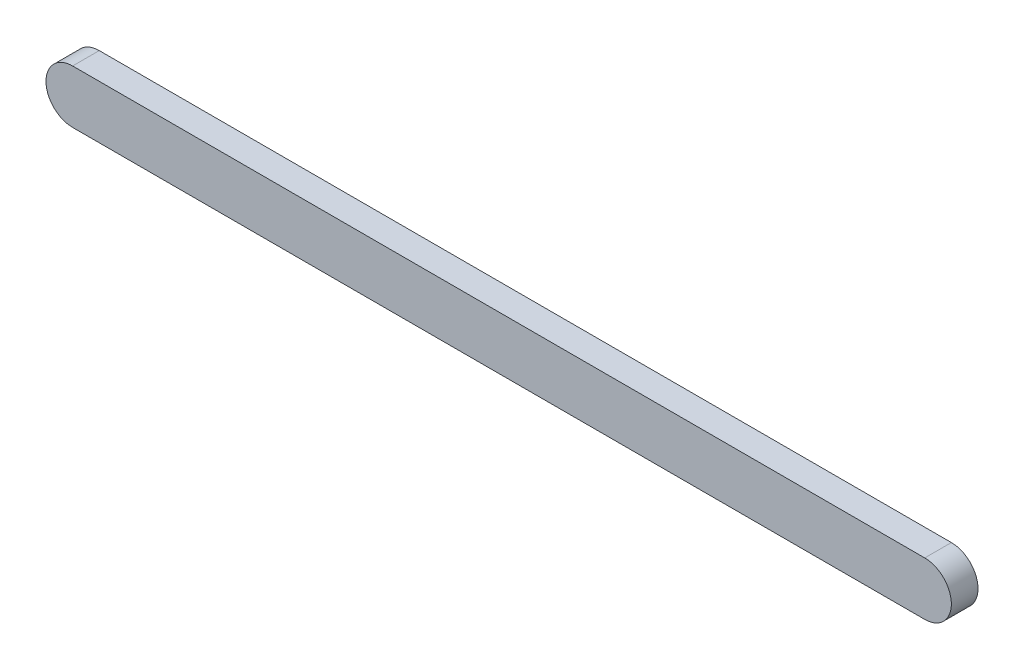
ISO-10303-21;
HEADER;
FILE_DESCRIPTION(('STEP AP214'),'2;1');
FILE_NAME('part.step','',(''),(''),'','','');
FILE_SCHEMA(('AUTOMOTIVE_DESIGN { 1 0 10303 214 1 1 1 1 }'));
ENDSEC;
DATA;
#1=APPLICATION_CONTEXT('core data for automotive mechanical design processes');
#2=APPLICATION_PROTOCOL_DEFINITION('international standard','automotive_design',2000,#1);
#3=PRODUCT_CONTEXT('',#1,'mechanical');
#4=PRODUCT('Part','Part','',(#3));
#5=PRODUCT_RELATED_PRODUCT_CATEGORY('part','',(#4));
#6=PRODUCT_DEFINITION_FORMATION('','',#4);
#7=PRODUCT_DEFINITION_CONTEXT('part definition',#1,'design');
#8=PRODUCT_DEFINITION('design','',#6,#7);
#9=PRODUCT_DEFINITION_SHAPE('','',#8);
#10=(LENGTH_UNIT() NAMED_UNIT(*) SI_UNIT(.MILLI.,.METRE.));
#11=(NAMED_UNIT(*) PLANE_ANGLE_UNIT() SI_UNIT($,.RADIAN.));
#12=(NAMED_UNIT(*) SI_UNIT($,.STERADIAN.) SOLID_ANGLE_UNIT());
#13=UNCERTAINTY_MEASURE_WITH_UNIT(LENGTH_MEASURE(1.E-05),#10,'distance_accuracy_value','');
#14=(GEOMETRIC_REPRESENTATION_CONTEXT(3) GLOBAL_UNCERTAINTY_ASSIGNED_CONTEXT((#13)) GLOBAL_UNIT_ASSIGNED_CONTEXT((#10,
#11,#12)) REPRESENTATION_CONTEXT('',''));
#15=CARTESIAN_POINT('',(0.,0.,0.));
#16=DIRECTION('',(0.,0.,1.));
#17=DIRECTION('',(1.,0.,0.));
#18=AXIS2_PLACEMENT_3D('',#15,#16,#17);
#19=CARTESIAN_POINT('',(-53.3333333333333,-2.66666666666666,2.5));
#20=DIRECTION('',(0.,0.,-1.));
#21=DIRECTION('',(-1.,0.,0.));
#22=AXIS2_PLACEMENT_3D('',#19,#20,#21);
#23=CYLINDRICAL_SURFACE('',#22,2.5);
#24=CARTESIAN_POINT('',(-53.3333333333333,-2.66666666666666,0.));
#25=DIRECTION('',(0.,0.,1.));
#26=DIRECTION('',(1.,0.,0.));
#27=AXIS2_PLACEMENT_3D('',#24,#25,#26);
#28=CIRCLE('',#27,2.5);
#29=CARTESIAN_POINT('',(-53.3333333333333,-0.166666666666655,0.));
#30=VERTEX_POINT('',#29);
#31=CARTESIAN_POINT('',(-53.3333333333333,-5.16666666666666,0.));
#32=VERTEX_POINT('',#31);
#33=EDGE_CURVE('E111',#30,#32,#28,.T.);
#34=ORIENTED_EDGE('',*,*,#33,.T.);
#35=DIRECTION('',(0.,0.,-1.));
#36=VECTOR('',#35,1.);
#37=CARTESIAN_POINT('',(-53.3333333333333,-5.16666666666666,2.5));
#38=LINE('',#37,#36);
#39=CARTESIAN_POINT('',(-53.3333333333333,-5.16666666666666,2.5));
#40=VERTEX_POINT('',#39);
#41=EDGE_CURVE('E11',#40,#32,#38,.T.);
#42=ORIENTED_EDGE('',*,*,#41,.F.);
#43=CARTESIAN_POINT('',(-53.3333333333333,-2.66666666666666,2.5));
#44=DIRECTION('',(0.,0.,1.));
#45=DIRECTION('',(1.,0.,0.));
#46=AXIS2_PLACEMENT_3D('',#43,#44,#45);
#47=CIRCLE('',#46,2.5);
#48=CARTESIAN_POINT('',(-53.3333333333333,-0.166666666666655,2.5));
#49=VERTEX_POINT('',#48);
#50=EDGE_CURVE('E95',#49,#40,#47,.T.);
#51=ORIENTED_EDGE('',*,*,#50,.F.);
#52=DIRECTION('',(0.,0.,-1.));
#53=VECTOR('',#52,1.);
#54=CARTESIAN_POINT('',(-53.3333333333333,-0.166666666666655,2.5));
#55=LINE('',#54,#53);
#56=EDGE_CURVE('E107',#49,#30,#55,.T.);
#57=ORIENTED_EDGE('',*,*,#56,.T.);
#58=EDGE_LOOP('',(#34,#42,#51,#57));
#59=FACE_BOUND('',#58,.T.);
#60=ADVANCED_FACE('F43',(#59),#23,.T.);
#61=CARTESIAN_POINT('',(-53.3333333333333,-5.16666666666666,2.5));
#62=DIRECTION('',(0.,1.,0.));
#63=DIRECTION('',(0.,0.,1.));
#64=AXIS2_PLACEMENT_3D('',#61,#62,#63);
#65=PLANE('',#64);
#66=DIRECTION('',(1.,0.,0.));
#67=VECTOR('',#66,1.);
#68=CARTESIAN_POINT('',(-53.3333333333333,-5.16666666666666,0.));
#69=LINE('',#68,#67);
#70=CARTESIAN_POINT('',(26.6666666666667,-5.16666666666666,0.));
#71=VERTEX_POINT('',#70);
#72=EDGE_CURVE('E100',#32,#71,#69,.T.);
#73=ORIENTED_EDGE('',*,*,#72,.T.);
#74=DIRECTION('',(0.,0.,-1.));
#75=VECTOR('',#74,1.);
#76=CARTESIAN_POINT('',(26.6666666666667,-5.16666666666666,2.5));
#77=LINE('',#76,#75);
#78=CARTESIAN_POINT('',(26.6666666666667,-5.16666666666666,2.5));
#79=VERTEX_POINT('',#78);
#80=EDGE_CURVE('E52',#79,#71,#77,.T.);
#81=ORIENTED_EDGE('',*,*,#80,.F.);
#82=DIRECTION('',(1.,0.,0.));
#83=VECTOR('',#82,1.);
#84=CARTESIAN_POINT('',(-53.3333333333333,-5.16666666666666,2.5));
#85=LINE('',#84,#83);
#86=EDGE_CURVE('E90',#40,#79,#85,.T.);
#87=ORIENTED_EDGE('',*,*,#86,.F.);
#88=ORIENTED_EDGE('',*,*,#41,.T.);
#89=EDGE_LOOP('',(#73,#81,#87,#88));
#90=FACE_BOUND('',#89,.T.);
#91=ADVANCED_FACE('F99',(#90),#65,.F.);
#92=CARTESIAN_POINT('',(26.6666666666667,-2.66666666666666,2.5));
#93=DIRECTION('',(0.,0.,-1.));
#94=DIRECTION('',(-1.,0.,0.));
#95=AXIS2_PLACEMENT_3D('',#92,#93,#94);
#96=CYLINDRICAL_SURFACE('',#95,2.5);
#97=CARTESIAN_POINT('',(26.6666666666667,-2.66666666666666,0.));
#98=DIRECTION('',(0.,0.,1.));
#99=DIRECTION('',(1.,0.,0.));
#100=AXIS2_PLACEMENT_3D('',#97,#98,#99);
#101=CIRCLE('',#100,2.5);
#102=CARTESIAN_POINT('',(26.6666666666667,-0.166666666666655,0.));
#103=VERTEX_POINT('',#102);
#104=EDGE_CURVE('E77',#71,#103,#101,.T.);
#105=ORIENTED_EDGE('',*,*,#104,.T.);
#106=DIRECTION('',(0.,0.,-1.));
#107=VECTOR('',#106,1.);
#108=CARTESIAN_POINT('',(26.6666666666667,-0.166666666666655,2.5));
#109=LINE('',#108,#107);
#110=CARTESIAN_POINT('',(26.6666666666667,-0.166666666666655,2.5));
#111=VERTEX_POINT('',#110);
#112=EDGE_CURVE('E102',#111,#103,#109,.T.);
#113=ORIENTED_EDGE('',*,*,#112,.F.);
#114=CARTESIAN_POINT('',(26.6666666666667,-2.66666666666666,2.5));
#115=DIRECTION('',(0.,0.,1.));
#116=DIRECTION('',(1.,0.,0.));
#117=AXIS2_PLACEMENT_3D('',#114,#115,#116);
#118=CIRCLE('',#117,2.5);
#119=EDGE_CURVE('E93',#79,#111,#118,.T.);
#120=ORIENTED_EDGE('',*,*,#119,.F.);
#121=ORIENTED_EDGE('',*,*,#80,.T.);
#122=EDGE_LOOP('',(#105,#113,#120,#121));
#123=FACE_BOUND('',#122,.T.);
#124=ADVANCED_FACE('F103',(#123),#96,.T.);
#125=CARTESIAN_POINT('',(-53.3333333333333,-0.166666666666655,2.5));
#126=DIRECTION('',(0.,-1.,0.));
#127=DIRECTION('',(0.,0.,-1.));
#128=AXIS2_PLACEMENT_3D('',#125,#126,#127);
#129=PLANE('',#128);
#130=DIRECTION('',(-1.,0.,0.));
#131=VECTOR('',#130,1.);
#132=CARTESIAN_POINT('',(-53.3333333333333,-0.166666666666655,0.));
#133=LINE('',#132,#131);
#134=EDGE_CURVE('E83',#103,#30,#133,.T.);
#135=ORIENTED_EDGE('',*,*,#134,.T.);
#136=ORIENTED_EDGE('',*,*,#56,.F.);
#137=DIRECTION('',(-1.,0.,0.));
#138=VECTOR('',#137,1.);
#139=CARTESIAN_POINT('',(-53.3333333333333,-0.166666666666655,2.5));
#140=LINE('',#139,#138);
#141=EDGE_CURVE('E60',#111,#49,#140,.T.);
#142=ORIENTED_EDGE('',*,*,#141,.F.);
#143=ORIENTED_EDGE('',*,*,#112,.T.);
#144=EDGE_LOOP('',(#135,#136,#142,#143));
#145=FACE_BOUND('',#144,.T.);
#146=ADVANCED_FACE('F124',(#145),#129,.F.);
#147=CARTESIAN_POINT('',(-53.3333333333333,-2.66666666666666,2.5));
#148=DIRECTION('',(0.,0.,1.));
#149=DIRECTION('',(1.,0.,0.));
#150=AXIS2_PLACEMENT_3D('',#147,#148,#149);
#151=PLANE('',#150);
#152=ORIENTED_EDGE('',*,*,#50,.T.);
#153=ORIENTED_EDGE('',*,*,#86,.T.);
#154=ORIENTED_EDGE('',*,*,#119,.T.);
#155=ORIENTED_EDGE('',*,*,#141,.T.);
#156=EDGE_LOOP('',(#152,#153,#154,#155));
#157=FACE_BOUND('',#156,.T.);
#158=ADVANCED_FACE('F91',(#157),#151,.T.);
#159=CARTESIAN_POINT('',(-53.3333333333333,-2.66666666666666,0.));
#160=DIRECTION('',(0.,0.,1.));
#161=DIRECTION('',(1.,0.,0.));
#162=AXIS2_PLACEMENT_3D('',#159,#160,#161);
#163=PLANE('',#162);
#164=ORIENTED_EDGE('',*,*,#33,.F.);
#165=ORIENTED_EDGE('',*,*,#134,.F.);
#166=ORIENTED_EDGE('',*,*,#104,.F.);
#167=ORIENTED_EDGE('',*,*,#72,.F.);
#168=EDGE_LOOP('',(#164,#165,#166,#167));
#169=FACE_BOUND('',#168,.T.);
#170=ADVANCED_FACE('F127',(#169),#163,.F.);
#171=CLOSED_SHELL('',(#60,#91,#124,#146,#158,#170));
#172=MANIFOLD_SOLID_BREP('B2',#171);
#173=ADVANCED_BREP_SHAPE_REPRESENTATION('',(#18,#172),#14);
#174=SHAPE_DEFINITION_REPRESENTATION(#9,#173);
ENDSEC;
END-ISO-10303-21;
